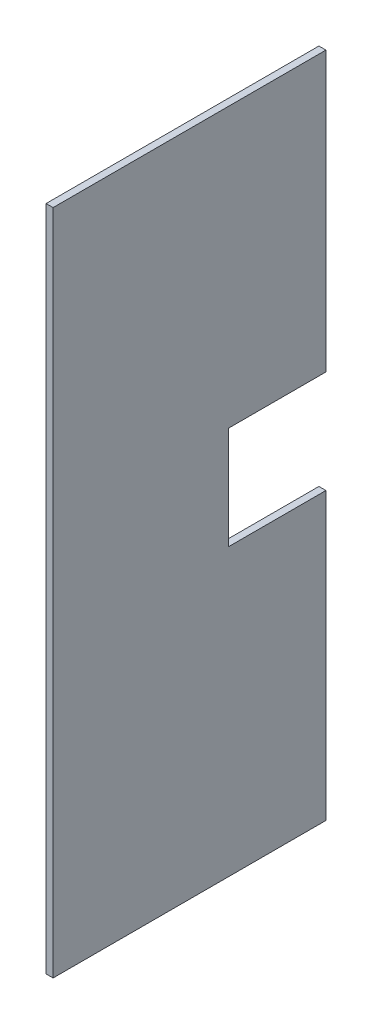
ISO-10303-21;
HEADER;
FILE_DESCRIPTION(('STEP AP214'),'2;1');
FILE_NAME('part.step','',(''),(''),'','','');
FILE_SCHEMA(('AUTOMOTIVE_DESIGN { 1 0 10303 214 1 1 1 1 }'));
ENDSEC;
DATA;
#1=APPLICATION_CONTEXT('core data for automotive mechanical design processes');
#2=APPLICATION_PROTOCOL_DEFINITION('international standard','automotive_design',2000,#1);
#3=PRODUCT_CONTEXT('',#1,'mechanical');
#4=PRODUCT('Part','Part','',(#3));
#5=PRODUCT_RELATED_PRODUCT_CATEGORY('part','',(#4));
#6=PRODUCT_DEFINITION_FORMATION('','',#4);
#7=PRODUCT_DEFINITION_CONTEXT('part definition',#1,'design');
#8=PRODUCT_DEFINITION('design','',#6,#7);
#9=PRODUCT_DEFINITION_SHAPE('','',#8);
#10=(LENGTH_UNIT() NAMED_UNIT(*) SI_UNIT(.MILLI.,.METRE.));
#11=(NAMED_UNIT(*) PLANE_ANGLE_UNIT() SI_UNIT($,.RADIAN.));
#12=(NAMED_UNIT(*) SI_UNIT($,.STERADIAN.) SOLID_ANGLE_UNIT());
#13=UNCERTAINTY_MEASURE_WITH_UNIT(LENGTH_MEASURE(1.E-05),#10,'distance_accuracy_value','');
#14=(GEOMETRIC_REPRESENTATION_CONTEXT(3) GLOBAL_UNCERTAINTY_ASSIGNED_CONTEXT((#13)) GLOBAL_UNIT_ASSIGNED_CONTEXT((#10,
#11,#12)) REPRESENTATION_CONTEXT('',''));
#15=CARTESIAN_POINT('',(0.,0.,0.));
#16=DIRECTION('',(0.,0.,1.));
#17=DIRECTION('',(1.,0.,0.));
#18=AXIS2_PLACEMENT_3D('',#15,#16,#17);
#19=CARTESIAN_POINT('',(1.,100.85,3.40000000000002));
#20=DIRECTION('',(0.,0.,-1.));
#21=DIRECTION('',(0.,1.,0.));
#22=AXIS2_PLACEMENT_3D('',#19,#20,#21);
#23=PLANE('',#22);
#24=DIRECTION('',(1.,0.,0.));
#25=VECTOR('',#24,1.);
#26=CARTESIAN_POINT('',(1.,61.1558991337893,3.40000000000002));
#27=LINE('',#26,#25);
#28=CARTESIAN_POINT('',(0.,61.1558991337893,3.40000000000002));
#29=VERTEX_POINT('',#28);
#30=CARTESIAN_POINT('',(1.,61.1558991337893,3.40000000000002));
#31=VERTEX_POINT('',#30);
#32=EDGE_CURVE('E124',#29,#31,#27,.T.);
#33=ORIENTED_EDGE('',*,*,#32,.F.);
#34=DIRECTION('',(0.,-1.,0.));
#35=VECTOR('',#34,1.);
#36=CARTESIAN_POINT('',(0.,5.85000000000011,3.40000000000002));
#37=LINE('',#36,#35);
#38=CARTESIAN_POINT('',(0.,100.85,3.40000000000002));
#39=VERTEX_POINT('',#38);
#40=EDGE_CURVE('E133',#39,#29,#37,.T.);
#41=ORIENTED_EDGE('',*,*,#40,.F.);
#42=DIRECTION('',(-1.,0.,0.));
#43=VECTOR('',#42,1.);
#44=CARTESIAN_POINT('',(1.,100.85,3.40000000000002));
#45=LINE('',#44,#43);
#46=CARTESIAN_POINT('',(1.,100.85,3.40000000000002));
#47=VERTEX_POINT('',#46);
#48=EDGE_CURVE('E153',#47,#39,#45,.T.);
#49=ORIENTED_EDGE('',*,*,#48,.F.);
#50=DIRECTION('',(0.,-1.,0.));
#51=VECTOR('',#50,1.);
#52=CARTESIAN_POINT('',(1.,100.85,3.40000000000002));
#53=LINE('',#52,#51);
#54=EDGE_CURVE('E148',#47,#31,#53,.T.);
#55=ORIENTED_EDGE('',*,*,#54,.T.);
#56=EDGE_LOOP('',(#33,#41,#49,#55));
#57=FACE_BOUND('',#56,.T.);
#58=ADVANCED_FACE('F32',(#57),#23,.T.);
#59=CARTESIAN_POINT('',(1.,5.85000000000011,3.40000000000003));
#60=DIRECTION('',(0.,-1.,0.));
#61=DIRECTION('',(0.,0.,-1.));
#62=AXIS2_PLACEMENT_3D('',#59,#60,#61);
#63=PLANE('',#62);
#64=DIRECTION('',(-1.,0.,0.));
#65=VECTOR('',#64,1.);
#66=CARTESIAN_POINT('',(1.,5.85000000000012,42.25));
#67=LINE('',#66,#65);
#68=CARTESIAN_POINT('',(1.,5.85000000000012,42.25));
#69=VERTEX_POINT('',#68);
#70=CARTESIAN_POINT('',(0.,5.85000000000012,42.25));
#71=VERTEX_POINT('',#70);
#72=EDGE_CURVE('E151',#69,#71,#67,.T.);
#73=ORIENTED_EDGE('',*,*,#72,.T.);
#74=DIRECTION('',(0.,0.,1.));
#75=VECTOR('',#74,1.);
#76=CARTESIAN_POINT('',(0.,5.85000000000012,42.25));
#77=LINE('',#76,#75);
#78=CARTESIAN_POINT('',(0.,5.85000000000011,3.40000000000002));
#79=VERTEX_POINT('',#78);
#80=EDGE_CURVE('E136',#79,#71,#77,.T.);
#81=ORIENTED_EDGE('',*,*,#80,.F.);
#82=DIRECTION('',(-1.,0.,0.));
#83=VECTOR('',#82,1.);
#84=CARTESIAN_POINT('',(1.,5.85000000000011,3.40000000000003));
#85=LINE('',#84,#83);
#86=CARTESIAN_POINT('',(1.,5.85000000000011,3.40000000000003));
#87=VERTEX_POINT('',#86);
#88=EDGE_CURVE('E40',#87,#79,#85,.T.);
#89=ORIENTED_EDGE('',*,*,#88,.F.);
#90=DIRECTION('',(0.,0.,1.));
#91=VECTOR('',#90,1.);
#92=CARTESIAN_POINT('',(1.,5.85000000000011,3.40000000000003));
#93=LINE('',#92,#91);
#94=EDGE_CURVE('E139',#87,#69,#93,.T.);
#95=ORIENTED_EDGE('',*,*,#94,.T.);
#96=EDGE_LOOP('',(#73,#81,#89,#95));
#97=FACE_BOUND('',#96,.T.);
#98=ADVANCED_FACE('F34',(#97),#63,.T.);
#99=DIRECTION('',(-1.,0.,0.));
#100=VECTOR('',#99,1.);
#101=CARTESIAN_POINT('',(1.,46.5418524919698,3.40000000000002));
#102=LINE('',#101,#100);
#103=CARTESIAN_POINT('',(1.,46.5418524919698,3.40000000000003));
#104=VERTEX_POINT('',#103);
#105=CARTESIAN_POINT('',(0.,46.541852795905,3.40000000000002));
#106=VERTEX_POINT('',#105);
#107=EDGE_CURVE('E47',#104,#106,#102,.T.);
#108=ORIENTED_EDGE('',*,*,#107,.F.);
#109=EDGE_CURVE('E53',#104,#87,#53,.T.);
#110=ORIENTED_EDGE('',*,*,#109,.T.);
#111=ORIENTED_EDGE('',*,*,#88,.T.);
#112=EDGE_CURVE('E132',#106,#79,#37,.T.);
#113=ORIENTED_EDGE('',*,*,#112,.F.);
#114=EDGE_LOOP('',(#108,#110,#111,#113));
#115=FACE_BOUND('',#114,.T.);
#116=ADVANCED_FACE('F176',(#115),#23,.T.);
#117=CARTESIAN_POINT('',(1.,100.85,42.25));
#118=DIRECTION('',(0.,1.,0.));
#119=DIRECTION('',(0.,0.,1.));
#120=AXIS2_PLACEMENT_3D('',#117,#118,#119);
#121=PLANE('',#120);
#122=ORIENTED_EDGE('',*,*,#48,.T.);
#123=DIRECTION('',(0.,0.,-1.));
#124=VECTOR('',#123,1.);
#125=CARTESIAN_POINT('',(0.,100.85,3.40000000000002));
#126=LINE('',#125,#124);
#127=CARTESIAN_POINT('',(0.,100.85,42.25));
#128=VERTEX_POINT('',#127);
#129=EDGE_CURVE('E129',#128,#39,#126,.T.);
#130=ORIENTED_EDGE('',*,*,#129,.F.);
#131=DIRECTION('',(-1.,0.,0.));
#132=VECTOR('',#131,1.);
#133=CARTESIAN_POINT('',(1.,100.85,42.25));
#134=LINE('',#133,#132);
#135=CARTESIAN_POINT('',(1.,100.85,42.25));
#136=VERTEX_POINT('',#135);
#137=EDGE_CURVE('E155',#136,#128,#134,.T.);
#138=ORIENTED_EDGE('',*,*,#137,.F.);
#139=DIRECTION('',(0.,0.,-1.));
#140=VECTOR('',#139,1.);
#141=CARTESIAN_POINT('',(1.,100.85,42.25));
#142=LINE('',#141,#140);
#143=EDGE_CURVE('E145',#136,#47,#142,.T.);
#144=ORIENTED_EDGE('',*,*,#143,.T.);
#145=EDGE_LOOP('',(#122,#130,#138,#144));
#146=FACE_BOUND('',#145,.T.);
#147=ADVANCED_FACE('F168',(#146),#121,.T.);
#148=CARTESIAN_POINT('',(1.,5.85000000000012,42.25));
#149=DIRECTION('',(0.,0.,1.));
#150=DIRECTION('',(0.,-1.,0.));
#151=AXIS2_PLACEMENT_3D('',#148,#149,#150);
#152=PLANE('',#151);
#153=ORIENTED_EDGE('',*,*,#137,.T.);
#154=DIRECTION('',(0.,1.,0.));
#155=VECTOR('',#154,1.);
#156=CARTESIAN_POINT('',(0.,100.85,42.25));
#157=LINE('',#156,#155);
#158=EDGE_CURVE('E126',#71,#128,#157,.T.);
#159=ORIENTED_EDGE('',*,*,#158,.F.);
#160=ORIENTED_EDGE('',*,*,#72,.F.);
#161=DIRECTION('',(0.,1.,0.));
#162=VECTOR('',#161,1.);
#163=CARTESIAN_POINT('',(1.,5.85000000000012,42.25));
#164=LINE('',#163,#162);
#165=EDGE_CURVE('E142',#69,#136,#164,.T.);
#166=ORIENTED_EDGE('',*,*,#165,.T.);
#167=EDGE_LOOP('',(#153,#159,#160,#166));
#168=FACE_BOUND('',#167,.T.);
#169=ADVANCED_FACE('F164',(#168),#152,.T.);
#170=CARTESIAN_POINT('',(1.,0.,0.));
#171=DIRECTION('',(-1.,0.,0.));
#172=DIRECTION('',(0.,0.,1.));
#173=AXIS2_PLACEMENT_3D('',#170,#171,#172);
#174=PLANE('',#173);
#175=DIRECTION('',(0.,0.999999999999999,-4.37114050709792E-08));
#176=VECTOR('',#175,1.);
#177=CARTESIAN_POINT('',(1.,46.5418530998402,17.3065609769447));
#178=LINE('',#177,#176);
#179=CARTESIAN_POINT('',(1.,46.5418530998402,17.3065609769447));
#180=VERTEX_POINT('',#179);
#181=CARTESIAN_POINT('',(1.,61.1558997416626,17.3065603381442));
#182=VERTEX_POINT('',#181);
#183=EDGE_CURVE('E107',#180,#182,#178,.T.);
#184=ORIENTED_EDGE('',*,*,#183,.T.);
#185=DIRECTION('',(0.,-4.37112610815E-08,-0.999999999999999));
#186=VECTOR('',#185,1.);
#187=CARTESIAN_POINT('',(1.,61.1558987523328,-5.32673278321498));
#188=LINE('',#187,#186);
#189=EDGE_CURVE('E104',#182,#31,#188,.T.);
#190=ORIENTED_EDGE('',*,*,#189,.T.);
#191=ORIENTED_EDGE('',*,*,#54,.F.);
#192=ORIENTED_EDGE('',*,*,#143,.F.);
#193=ORIENTED_EDGE('',*,*,#165,.F.);
#194=ORIENTED_EDGE('',*,*,#94,.F.);
#195=ORIENTED_EDGE('',*,*,#109,.F.);
#196=DIRECTION('',(0.,4.37110532135107E-08,0.999999999999999));
#197=VECTOR('',#196,1.);
#198=CARTESIAN_POINT('',(1.,46.5418521105151,-5.32673278321498));
#199=LINE('',#198,#197);
#200=EDGE_CURVE('E99',#104,#180,#199,.T.);
#201=ORIENTED_EDGE('',*,*,#200,.T.);
#202=EDGE_LOOP('',(#184,#190,#191,#192,#193,#194,#195,#201));
#203=FACE_BOUND('',#202,.T.);
#204=ADVANCED_FACE('F113',(#203),#174,.F.);
#205=CARTESIAN_POINT('',(0.,0.,0.));
#206=DIRECTION('',(1.,0.,0.));
#207=DIRECTION('',(0.,0.,-1.));
#208=AXIS2_PLACEMENT_3D('',#205,#206,#207);
#209=PLANE('',#208);
#210=ORIENTED_EDGE('',*,*,#40,.T.);
#211=DIRECTION('',(0.,-4.37112610815E-08,-0.999999999999999));
#212=VECTOR('',#211,1.);
#213=CARTESIAN_POINT('',(0.,61.1558987523328,-5.32673278321498));
#214=LINE('',#213,#212);
#215=CARTESIAN_POINT('',(0.,61.1558997416626,17.3065603381442));
#216=VERTEX_POINT('',#215);
#217=EDGE_CURVE('E115',#216,#29,#214,.T.);
#218=ORIENTED_EDGE('',*,*,#217,.F.);
#219=DIRECTION('',(0.,0.999999999999999,-4.37114050709792E-08));
#220=VECTOR('',#219,1.);
#221=CARTESIAN_POINT('',(0.,46.5418530998402,17.3065609769447));
#222=LINE('',#221,#220);
#223=CARTESIAN_POINT('',(0.,46.5418530998402,17.3065609769447));
#224=VERTEX_POINT('',#223);
#225=EDGE_CURVE('E117',#224,#216,#222,.T.);
#226=ORIENTED_EDGE('',*,*,#225,.F.);
#227=DIRECTION('',(0.,-4.37110532135107E-08,-0.999999999999999));
#228=VECTOR('',#227,1.);
#229=CARTESIAN_POINT('',(0.,46.5418523433521,-2.03439338443562E-06));
#230=LINE('',#229,#228);
#231=EDGE_CURVE('E11',#224,#106,#230,.T.);
#232=ORIENTED_EDGE('',*,*,#231,.T.);
#233=ORIENTED_EDGE('',*,*,#112,.T.);
#234=ORIENTED_EDGE('',*,*,#80,.T.);
#235=ORIENTED_EDGE('',*,*,#158,.T.);
#236=ORIENTED_EDGE('',*,*,#129,.T.);
#237=EDGE_LOOP('',(#210,#218,#226,#232,#233,#234,#235,#236));
#238=FACE_BOUND('',#237,.T.);
#239=ADVANCED_FACE('F162',(#238),#209,.F.);
#240=CARTESIAN_POINT('',(1.,61.1558987523328,-5.32673278321498));
#241=DIRECTION('',(0.,0.999999999999999,-4.37112610815001E-08));
#242=DIRECTION('',(0.,4.37112610815001E-08,0.999999999999999));
#243=AXIS2_PLACEMENT_3D('',#240,#241,#242);
#244=PLANE('',#243);
#245=ORIENTED_EDGE('',*,*,#32,.T.);
#246=ORIENTED_EDGE('',*,*,#189,.F.);
#247=DIRECTION('',(-1.,0.,0.));
#248=VECTOR('',#247,1.);
#249=CARTESIAN_POINT('',(1.,61.1558997416626,17.3065603381442));
#250=LINE('',#249,#248);
#251=EDGE_CURVE('E103',#182,#216,#250,.T.);
#252=ORIENTED_EDGE('',*,*,#251,.T.);
#253=ORIENTED_EDGE('',*,*,#217,.T.);
#254=EDGE_LOOP('',(#245,#246,#252,#253));
#255=FACE_BOUND('',#254,.T.);
#256=ADVANCED_FACE('F175',(#255),#244,.F.);
#257=CARTESIAN_POINT('',(1.,46.5418530998402,17.3065609769447));
#258=DIRECTION('',(0.,4.37114050709792E-08,0.999999999999999));
#259=DIRECTION('',(0.,-0.999999999999999,4.37114050709792E-08));
#260=AXIS2_PLACEMENT_3D('',#257,#258,#259);
#261=PLANE('',#260);
#262=ORIENTED_EDGE('',*,*,#225,.T.);
#263=ORIENTED_EDGE('',*,*,#251,.F.);
#264=ORIENTED_EDGE('',*,*,#183,.F.);
#265=DIRECTION('',(-1.,0.,0.));
#266=VECTOR('',#265,1.);
#267=CARTESIAN_POINT('',(1.,46.5418530998402,17.3065609769447));
#268=LINE('',#267,#266);
#269=EDGE_CURVE('E95',#180,#224,#268,.T.);
#270=ORIENTED_EDGE('',*,*,#269,.T.);
#271=EDGE_LOOP('',(#262,#263,#264,#270));
#272=FACE_BOUND('',#271,.T.);
#273=ADVANCED_FACE('F108',(#272),#261,.F.);
#274=CARTESIAN_POINT('',(1.,46.5418521105151,-5.32673278321498));
#275=DIRECTION('',(0.,-0.999999999999999,4.37110532135107E-08));
#276=DIRECTION('',(0.,-4.37110532135107E-08,-0.999999999999999));
#277=AXIS2_PLACEMENT_3D('',#274,#275,#276);
#278=PLANE('',#277);
#279=ORIENTED_EDGE('',*,*,#107,.T.);
#280=ORIENTED_EDGE('',*,*,#231,.F.);
#281=ORIENTED_EDGE('',*,*,#269,.F.);
#282=ORIENTED_EDGE('',*,*,#200,.F.);
#283=EDGE_LOOP('',(#279,#280,#281,#282));
#284=FACE_BOUND('',#283,.T.);
#285=ADVANCED_FACE('F97',(#284),#278,.F.);
#286=CLOSED_SHELL('',(#58,#98,#116,#147,#169,#204,#239,#256,#273,#285));
#287=MANIFOLD_SOLID_BREP('B2',#286);
#288=ADVANCED_BREP_SHAPE_REPRESENTATION('',(#18,#287),#14);
#289=SHAPE_DEFINITION_REPRESENTATION(#9,#288);
ENDSEC;
END-ISO-10303-21;
